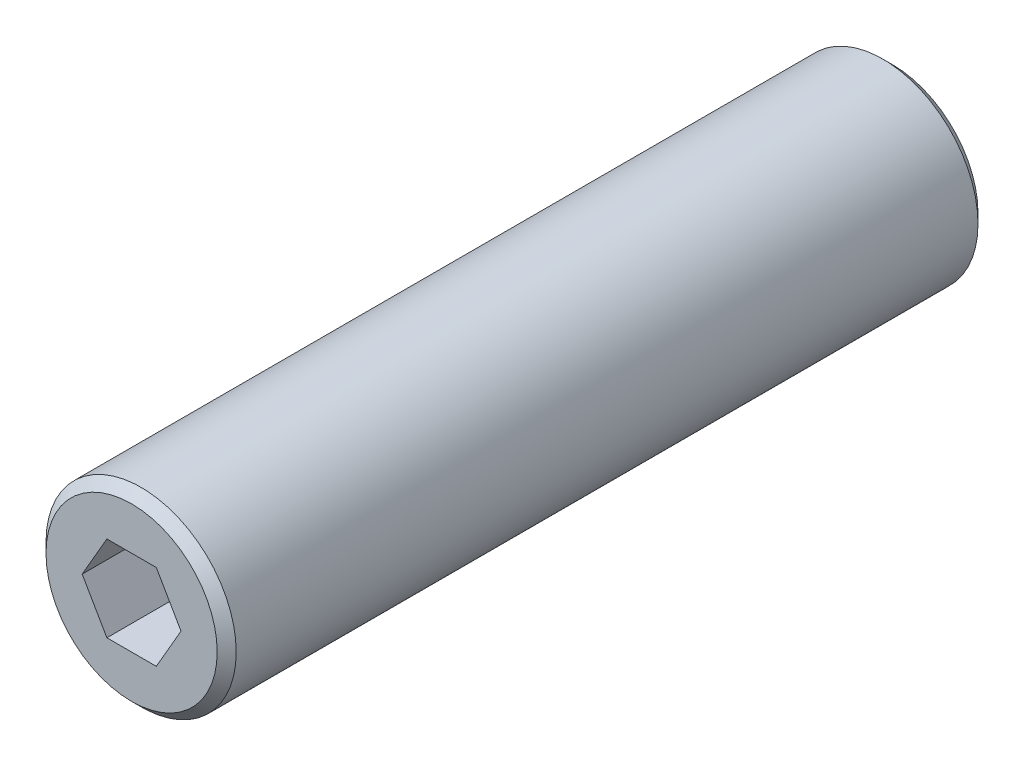
ISO-10303-21;
HEADER;
FILE_DESCRIPTION(('STEP AP214'),'2;1');
FILE_NAME('part.step','',(''),(''),'','','');
FILE_SCHEMA(('AUTOMOTIVE_DESIGN { 1 0 10303 214 1 1 1 1 }'));
ENDSEC;
DATA;
#1=APPLICATION_CONTEXT('core data for automotive mechanical design processes');
#2=APPLICATION_PROTOCOL_DEFINITION('international standard','automotive_design',2000,#1);
#3=PRODUCT_CONTEXT('',#1,'mechanical');
#4=PRODUCT('Part','Part','',(#3));
#5=PRODUCT_RELATED_PRODUCT_CATEGORY('part','',(#4));
#6=PRODUCT_DEFINITION_FORMATION('','',#4);
#7=PRODUCT_DEFINITION_CONTEXT('part definition',#1,'design');
#8=PRODUCT_DEFINITION('design','',#6,#7);
#9=PRODUCT_DEFINITION_SHAPE('','',#8);
#10=(LENGTH_UNIT() NAMED_UNIT(*) SI_UNIT(.MILLI.,.METRE.));
#11=(NAMED_UNIT(*) PLANE_ANGLE_UNIT() SI_UNIT($,.RADIAN.));
#12=(NAMED_UNIT(*) SI_UNIT($,.STERADIAN.) SOLID_ANGLE_UNIT());
#13=UNCERTAINTY_MEASURE_WITH_UNIT(LENGTH_MEASURE(1.E-05),#10,'distance_accuracy_value','');
#14=(GEOMETRIC_REPRESENTATION_CONTEXT(3) GLOBAL_UNCERTAINTY_ASSIGNED_CONTEXT((#13)) GLOBAL_UNIT_ASSIGNED_CONTEXT((#10,
#11,#12)) REPRESENTATION_CONTEXT('',''));
#15=CARTESIAN_POINT('',(0.,0.,0.));
#16=DIRECTION('',(0.,0.,1.));
#17=DIRECTION('',(1.,0.,0.));
#18=AXIS2_PLACEMENT_3D('',#15,#16,#17);
#19=CARTESIAN_POINT('',(0.,0.,4.));
#20=DIRECTION('',(0.,0.,-1.));
#21=DIRECTION('',(-1.,0.,0.));
#22=AXIS2_PLACEMENT_3D('',#19,#20,#21);
#23=CYLINDRICAL_SURFACE('',#22,1.);
#24=CARTESIAN_POINT('',(0.,0.,3.9));
#25=DIRECTION('',(0.,0.,1.));
#26=DIRECTION('',(1.,0.,0.));
#27=AXIS2_PLACEMENT_3D('',#24,#25,#26);
#28=CIRCLE('',#27,1.);
#29=CARTESIAN_POINT('',(1.,0.,3.9));
#30=VERTEX_POINT('',#29);
#31=EDGE_CURVE('E47',#30,#30,#28,.F.);
#32=ORIENTED_EDGE('',*,*,#31,.T.);
#33=EDGE_LOOP('',(#32));
#34=FACE_BOUND('',#33,.T.);
#35=CARTESIAN_POINT('',(0.,0.,-3.9));
#36=DIRECTION('',(0.,0.,1.));
#37=DIRECTION('',(1.,0.,0.));
#38=AXIS2_PLACEMENT_3D('',#35,#36,#37);
#39=CIRCLE('',#38,1.);
#40=CARTESIAN_POINT('',(1.,0.,-3.9));
#41=VERTEX_POINT('',#40);
#42=EDGE_CURVE('E149',#41,#41,#39,.T.);
#43=ORIENTED_EDGE('',*,*,#42,.T.);
#44=EDGE_LOOP('',(#43));
#45=FACE_BOUND('',#44,.T.);
#46=ADVANCED_FACE('F38',(#34,#45),#23,.T.);
#47=CARTESIAN_POINT('',(0.,0.,4.));
#48=DIRECTION('',(0.,0.,1.));
#49=DIRECTION('',(1.,0.,0.));
#50=AXIS2_PLACEMENT_3D('',#47,#48,#49);
#51=PLANE('',#50);
#52=CARTESIAN_POINT('',(0.,0.,4.));
#53=DIRECTION('',(0.,0.,1.));
#54=DIRECTION('',(1.,0.,0.));
#55=AXIS2_PLACEMENT_3D('',#52,#53,#54);
#56=CIRCLE('',#55,0.9);
#57=CARTESIAN_POINT('',(0.9,0.,4.));
#58=VERTEX_POINT('',#57);
#59=EDGE_CURVE('E141',#58,#58,#56,.T.);
#60=ORIENTED_EDGE('',*,*,#59,.T.);
#61=EDGE_LOOP('',(#60));
#62=FACE_BOUND('',#61,.T.);
#63=DIRECTION('',(-0.5,0.866025403784438,0.));
#64=VECTOR('',#63,1.);
#65=CARTESIAN_POINT('',(0.519615242270663,0.,4.));
#66=LINE('',#65,#64);
#67=CARTESIAN_POINT('',(0.519615242270663,0.,4.));
#68=VERTEX_POINT('',#67);
#69=CARTESIAN_POINT('',(0.259807621135332,0.45,4.));
#70=VERTEX_POINT('',#69);
#71=EDGE_CURVE('E54',#68,#70,#66,.T.);
#72=ORIENTED_EDGE('',*,*,#71,.F.);
#73=DIRECTION('',(0.5,0.866025403784438,0.));
#74=VECTOR('',#73,1.);
#75=CARTESIAN_POINT('',(0.259807621135332,-0.45,4.));
#76=LINE('',#75,#74);
#77=CARTESIAN_POINT('',(0.259807621135332,-0.45,4.));
#78=VERTEX_POINT('',#77);
#79=EDGE_CURVE('E137',#78,#68,#76,.T.);
#80=ORIENTED_EDGE('',*,*,#79,.F.);
#81=DIRECTION('',(1.,0.,0.));
#82=VECTOR('',#81,1.);
#83=CARTESIAN_POINT('',(-0.259807621135332,-0.45,4.));
#84=LINE('',#83,#82);
#85=CARTESIAN_POINT('',(-0.259807621135332,-0.45,4.));
#86=VERTEX_POINT('',#85);
#87=EDGE_CURVE('E135',#86,#78,#84,.T.);
#88=ORIENTED_EDGE('',*,*,#87,.F.);
#89=DIRECTION('',(0.5,-0.866025403784438,0.));
#90=VECTOR('',#89,1.);
#91=CARTESIAN_POINT('',(-0.519615242270663,0.,4.));
#92=LINE('',#91,#90);
#93=CARTESIAN_POINT('',(-0.519615242270663,0.,4.));
#94=VERTEX_POINT('',#93);
#95=EDGE_CURVE('E102',#94,#86,#92,.T.);
#96=ORIENTED_EDGE('',*,*,#95,.F.);
#97=DIRECTION('',(-0.5,-0.866025403784439,0.));
#98=VECTOR('',#97,1.);
#99=CARTESIAN_POINT('',(-0.259807621135332,0.45,4.));
#100=LINE('',#99,#98);
#101=CARTESIAN_POINT('',(-0.259807621135332,0.45,4.));
#102=VERTEX_POINT('',#101);
#103=EDGE_CURVE('E131',#102,#94,#100,.T.);
#104=ORIENTED_EDGE('',*,*,#103,.F.);
#105=DIRECTION('',(-1.,0.,0.));
#106=VECTOR('',#105,1.);
#107=CARTESIAN_POINT('',(0.259807621135332,0.45,4.));
#108=LINE('',#107,#106);
#109=EDGE_CURVE('E128',#70,#102,#108,.T.);
#110=ORIENTED_EDGE('',*,*,#109,.F.);
#111=EDGE_LOOP('',(#72,#80,#88,#96,#104,#110));
#112=FACE_BOUND('',#111,.T.);
#113=ADVANCED_FACE('F161',(#62,#112),#51,.T.);
#114=CARTESIAN_POINT('',(0.,0.,-4.));
#115=DIRECTION('',(0.,0.,1.));
#116=DIRECTION('',(1.,0.,0.));
#117=AXIS2_PLACEMENT_3D('',#114,#115,#116);
#118=PLANE('',#117);
#119=CARTESIAN_POINT('',(0.,0.,-4.));
#120=DIRECTION('',(0.,0.,1.));
#121=DIRECTION('',(1.,0.,0.));
#122=AXIS2_PLACEMENT_3D('',#119,#120,#121);
#123=CIRCLE('',#122,0.899999999999999);
#124=CARTESIAN_POINT('',(0.899999999999999,0.,-4.));
#125=VERTEX_POINT('',#124);
#126=EDGE_CURVE('E11',#125,#125,#123,.F.);
#127=ORIENTED_EDGE('',*,*,#126,.T.);
#128=EDGE_LOOP('',(#127));
#129=FACE_BOUND('',#128,.T.);
#130=ADVANCED_FACE('F164',(#129),#118,.F.);
#131=CARTESIAN_POINT('',(0.519615242270663,0.,3.2));
#132=DIRECTION('',(0.866025403784438,0.5,0.));
#133=DIRECTION('',(-0.5,0.866025403784439,0.));
#134=AXIS2_PLACEMENT_3D('',#131,#132,#133);
#135=PLANE('',#134);
#136=ORIENTED_EDGE('',*,*,#71,.T.);
#137=DIRECTION('',(0.,0.,1.));
#138=VECTOR('',#137,1.);
#139=CARTESIAN_POINT('',(0.259807621135332,0.45,3.2));
#140=LINE('',#139,#138);
#141=CARTESIAN_POINT('',(0.259807621135332,0.45,3.2));
#142=VERTEX_POINT('',#141);
#143=EDGE_CURVE('E84',#142,#70,#140,.T.);
#144=ORIENTED_EDGE('',*,*,#143,.F.);
#145=DIRECTION('',(-0.5,0.866025403784438,0.));
#146=VECTOR('',#145,1.);
#147=CARTESIAN_POINT('',(0.519615242270663,0.,3.2));
#148=LINE('',#147,#146);
#149=CARTESIAN_POINT('',(0.519615242270663,0.,3.2));
#150=VERTEX_POINT('',#149);
#151=EDGE_CURVE('E139',#150,#142,#148,.T.);
#152=ORIENTED_EDGE('',*,*,#151,.F.);
#153=DIRECTION('',(0.,0.,1.));
#154=VECTOR('',#153,1.);
#155=CARTESIAN_POINT('',(0.519615242270663,0.,3.2));
#156=LINE('',#155,#154);
#157=EDGE_CURVE('E62',#150,#68,#156,.T.);
#158=ORIENTED_EDGE('',*,*,#157,.T.);
#159=EDGE_LOOP('',(#136,#144,#152,#158));
#160=FACE_BOUND('',#159,.T.);
#161=ADVANCED_FACE('F172',(#160),#135,.F.);
#162=CARTESIAN_POINT('',(0.259807621135332,-0.45,3.2));
#163=DIRECTION('',(0.866025403784438,-0.5,0.));
#164=DIRECTION('',(0.5,0.866025403784439,0.));
#165=AXIS2_PLACEMENT_3D('',#162,#163,#164);
#166=PLANE('',#165);
#167=ORIENTED_EDGE('',*,*,#79,.T.);
#168=ORIENTED_EDGE('',*,*,#157,.F.);
#169=DIRECTION('',(0.5,0.866025403784438,0.));
#170=VECTOR('',#169,1.);
#171=CARTESIAN_POINT('',(0.259807621135332,-0.45,3.2));
#172=LINE('',#171,#170);
#173=CARTESIAN_POINT('',(0.259807621135332,-0.45,3.2));
#174=VERTEX_POINT('',#173);
#175=EDGE_CURVE('E114',#174,#150,#172,.T.);
#176=ORIENTED_EDGE('',*,*,#175,.F.);
#177=DIRECTION('',(0.,0.,1.));
#178=VECTOR('',#177,1.);
#179=CARTESIAN_POINT('',(0.259807621135332,-0.45,3.2));
#180=LINE('',#179,#178);
#181=EDGE_CURVE('E106',#174,#78,#180,.T.);
#182=ORIENTED_EDGE('',*,*,#181,.T.);
#183=EDGE_LOOP('',(#167,#168,#176,#182));
#184=FACE_BOUND('',#183,.T.);
#185=ADVANCED_FACE('F174',(#184),#166,.F.);
#186=CARTESIAN_POINT('',(-0.259807621135332,-0.45,3.2));
#187=DIRECTION('',(0.,-1.,0.));
#188=DIRECTION('',(0.,0.,-1.));
#189=AXIS2_PLACEMENT_3D('',#186,#187,#188);
#190=PLANE('',#189);
#191=ORIENTED_EDGE('',*,*,#87,.T.);
#192=ORIENTED_EDGE('',*,*,#181,.F.);
#193=DIRECTION('',(1.,0.,0.));
#194=VECTOR('',#193,1.);
#195=CARTESIAN_POINT('',(-0.259807621135332,-0.45,3.2));
#196=LINE('',#195,#194);
#197=CARTESIAN_POINT('',(-0.259807621135332,-0.45,3.2));
#198=VERTEX_POINT('',#197);
#199=EDGE_CURVE('E110',#198,#174,#196,.T.);
#200=ORIENTED_EDGE('',*,*,#199,.F.);
#201=DIRECTION('',(0.,0.,1.));
#202=VECTOR('',#201,1.);
#203=CARTESIAN_POINT('',(-0.259807621135332,-0.45,3.2));
#204=LINE('',#203,#202);
#205=EDGE_CURVE('E95',#198,#86,#204,.T.);
#206=ORIENTED_EDGE('',*,*,#205,.T.);
#207=EDGE_LOOP('',(#191,#192,#200,#206));
#208=FACE_BOUND('',#207,.T.);
#209=ADVANCED_FACE('F111',(#208),#190,.F.);
#210=CARTESIAN_POINT('',(-0.519615242270663,0.,3.2));
#211=DIRECTION('',(-0.866025403784438,-0.5,0.));
#212=DIRECTION('',(0.5,-0.866025403784439,0.));
#213=AXIS2_PLACEMENT_3D('',#210,#211,#212);
#214=PLANE('',#213);
#215=ORIENTED_EDGE('',*,*,#95,.T.);
#216=ORIENTED_EDGE('',*,*,#205,.F.);
#217=DIRECTION('',(0.5,-0.866025403784438,0.));
#218=VECTOR('',#217,1.);
#219=CARTESIAN_POINT('',(-0.519615242270663,0.,3.2));
#220=LINE('',#219,#218);
#221=CARTESIAN_POINT('',(-0.519615242270663,0.,3.2));
#222=VERTEX_POINT('',#221);
#223=EDGE_CURVE('E99',#222,#198,#220,.T.);
#224=ORIENTED_EDGE('',*,*,#223,.F.);
#225=DIRECTION('',(0.,0.,1.));
#226=VECTOR('',#225,1.);
#227=CARTESIAN_POINT('',(-0.519615242270663,0.,3.2));
#228=LINE('',#227,#226);
#229=EDGE_CURVE('E107',#222,#94,#228,.T.);
#230=ORIENTED_EDGE('',*,*,#229,.T.);
#231=EDGE_LOOP('',(#215,#216,#224,#230));
#232=FACE_BOUND('',#231,.T.);
#233=ADVANCED_FACE('F97',(#232),#214,.F.);
#234=CARTESIAN_POINT('',(-0.259807621135332,0.45,3.2));
#235=DIRECTION('',(-0.866025403784439,0.5,0.));
#236=DIRECTION('',(-0.5,-0.866025403784439,0.));
#237=AXIS2_PLACEMENT_3D('',#234,#235,#236);
#238=PLANE('',#237);
#239=ORIENTED_EDGE('',*,*,#103,.T.);
#240=ORIENTED_EDGE('',*,*,#229,.F.);
#241=DIRECTION('',(-0.5,-0.866025403784439,0.));
#242=VECTOR('',#241,1.);
#243=CARTESIAN_POINT('',(-0.259807621135332,0.45,3.2));
#244=LINE('',#243,#242);
#245=CARTESIAN_POINT('',(-0.259807621135332,0.45,3.2));
#246=VERTEX_POINT('',#245);
#247=EDGE_CURVE('E120',#246,#222,#244,.T.);
#248=ORIENTED_EDGE('',*,*,#247,.F.);
#249=DIRECTION('',(0.,0.,1.));
#250=VECTOR('',#249,1.);
#251=CARTESIAN_POINT('',(-0.259807621135332,0.45,3.2));
#252=LINE('',#251,#250);
#253=EDGE_CURVE('E144',#246,#102,#252,.T.);
#254=ORIENTED_EDGE('',*,*,#253,.T.);
#255=EDGE_LOOP('',(#239,#240,#248,#254));
#256=FACE_BOUND('',#255,.T.);
#257=ADVANCED_FACE('F230',(#256),#238,.F.);
#258=CARTESIAN_POINT('',(0.259807621135332,0.45,3.2));
#259=DIRECTION('',(0.,1.,0.));
#260=DIRECTION('',(-1.,0.,0.));
#261=AXIS2_PLACEMENT_3D('',#258,#259,#260);
#262=PLANE('',#261);
#263=ORIENTED_EDGE('',*,*,#109,.T.);
#264=ORIENTED_EDGE('',*,*,#253,.F.);
#265=DIRECTION('',(-1.,0.,0.));
#266=VECTOR('',#265,1.);
#267=CARTESIAN_POINT('',(0.259807621135332,0.45,3.2));
#268=LINE('',#267,#266);
#269=EDGE_CURVE('E122',#142,#246,#268,.T.);
#270=ORIENTED_EDGE('',*,*,#269,.F.);
#271=ORIENTED_EDGE('',*,*,#143,.T.);
#272=EDGE_LOOP('',(#263,#264,#270,#271));
#273=FACE_BOUND('',#272,.T.);
#274=ADVANCED_FACE('F170',(#273),#262,.F.);
#275=CARTESIAN_POINT('',(0.,0.,3.2));
#276=DIRECTION('',(0.,0.,1.));
#277=DIRECTION('',(1.,0.,0.));
#278=AXIS2_PLACEMENT_3D('',#275,#276,#277);
#279=PLANE('',#278);
#280=ORIENTED_EDGE('',*,*,#151,.T.);
#281=ORIENTED_EDGE('',*,*,#269,.T.);
#282=ORIENTED_EDGE('',*,*,#247,.T.);
#283=ORIENTED_EDGE('',*,*,#223,.T.);
#284=ORIENTED_EDGE('',*,*,#199,.T.);
#285=ORIENTED_EDGE('',*,*,#175,.T.);
#286=EDGE_LOOP('',(#280,#281,#282,#283,#284,#285));
#287=FACE_BOUND('',#286,.T.);
#288=ADVANCED_FACE('F117',(#287),#279,.T.);
#289=CARTESIAN_POINT('',(0.,0.,4.));
#290=DIRECTION('',(0.,0.,-1.));
#291=DIRECTION('',(-1.,0.,0.));
#292=AXIS2_PLACEMENT_3D('',#289,#290,#291);
#293=CONICAL_SURFACE('',#292,0.9,0.785398163397448);
#294=ORIENTED_EDGE('',*,*,#31,.F.);
#295=EDGE_LOOP('',(#294));
#296=FACE_BOUND('',#295,.T.);
#297=ORIENTED_EDGE('',*,*,#59,.F.);
#298=EDGE_LOOP('',(#297));
#299=FACE_BOUND('',#298,.T.);
#300=ADVANCED_FACE('F156',(#296,#299),#293,.T.);
#301=CARTESIAN_POINT('',(0.,0.,-3.9));
#302=DIRECTION('',(0.,0.,1.));
#303=DIRECTION('',(1.,0.,0.));
#304=AXIS2_PLACEMENT_3D('',#301,#302,#303);
#305=CONICAL_SURFACE('',#304,1.,0.78539816339744);
#306=ORIENTED_EDGE('',*,*,#126,.F.);
#307=EDGE_LOOP('',(#306));
#308=FACE_BOUND('',#307,.T.);
#309=ORIENTED_EDGE('',*,*,#42,.F.);
#310=EDGE_LOOP('',(#309));
#311=FACE_BOUND('',#310,.T.);
#312=ADVANCED_FACE('F41',(#308,#311),#305,.T.);
#313=CLOSED_SHELL('',(#46,#113,#130,#161,#185,#209,#233,#257,#274,#288,#300,#312));
#314=MANIFOLD_SOLID_BREP('B2',#313);
#315=ADVANCED_BREP_SHAPE_REPRESENTATION('',(#18,#314),#14);
#316=SHAPE_DEFINITION_REPRESENTATION(#9,#315);
ENDSEC;
END-ISO-10303-21;
